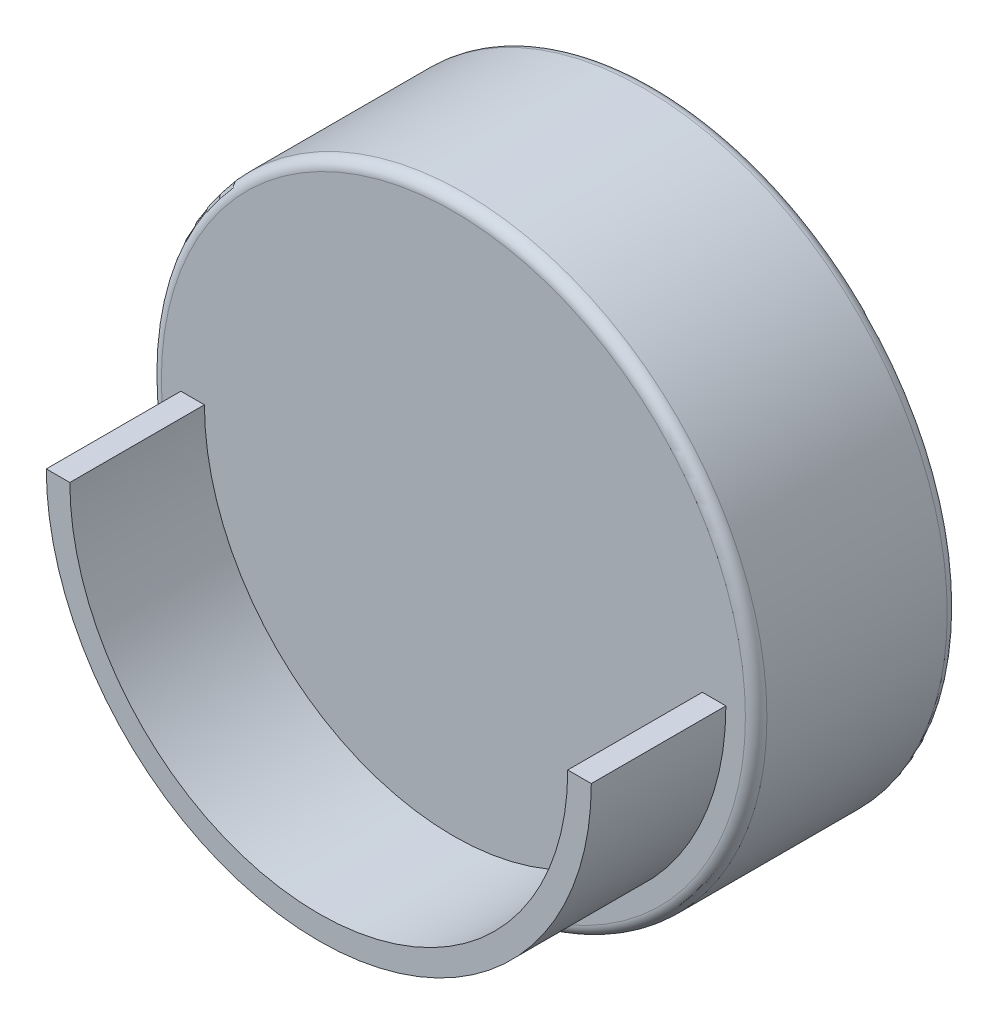
ISO-10303-21;
HEADER;
FILE_DESCRIPTION(('STEP AP214'),'2;1');
FILE_NAME('part.step','',(''),(''),'','','');
FILE_SCHEMA(('AUTOMOTIVE_DESIGN { 1 0 10303 214 1 1 1 1 }'));
ENDSEC;
DATA;
#1=APPLICATION_CONTEXT('core data for automotive mechanical design processes');
#2=APPLICATION_PROTOCOL_DEFINITION('international standard','automotive_design',2000,#1);
#3=PRODUCT_CONTEXT('',#1,'mechanical');
#4=PRODUCT('Part','Part','',(#3));
#5=PRODUCT_RELATED_PRODUCT_CATEGORY('part','',(#4));
#6=PRODUCT_DEFINITION_FORMATION('','',#4);
#7=PRODUCT_DEFINITION_CONTEXT('part definition',#1,'design');
#8=PRODUCT_DEFINITION('design','',#6,#7);
#9=PRODUCT_DEFINITION_SHAPE('','',#8);
#10=(LENGTH_UNIT() NAMED_UNIT(*) SI_UNIT(.MILLI.,.METRE.));
#11=(NAMED_UNIT(*) PLANE_ANGLE_UNIT() SI_UNIT($,.RADIAN.));
#12=(NAMED_UNIT(*) SI_UNIT($,.STERADIAN.) SOLID_ANGLE_UNIT());
#13=UNCERTAINTY_MEASURE_WITH_UNIT(LENGTH_MEASURE(1.E-05),#10,'distance_accuracy_value','');
#14=(GEOMETRIC_REPRESENTATION_CONTEXT(3) GLOBAL_UNCERTAINTY_ASSIGNED_CONTEXT((#13)) GLOBAL_UNIT_ASSIGNED_CONTEXT((#10,
#11,#12)) REPRESENTATION_CONTEXT('',''));
#15=CARTESIAN_POINT('',(0.,0.,0.));
#16=DIRECTION('',(0.,0.,1.));
#17=DIRECTION('',(1.,0.,0.));
#18=AXIS2_PLACEMENT_3D('',#15,#16,#17);
#19=CARTESIAN_POINT('',(0.,0.,15.));
#20=DIRECTION('',(0.,0.,-1.));
#21=DIRECTION('',(-1.,0.,0.));
#22=AXIS2_PLACEMENT_3D('',#19,#20,#21);
#23=CYLINDRICAL_SURFACE('',#22,22.5);
#24=CARTESIAN_POINT('',(0.,0.,0.8));
#25=DIRECTION('',(0.,0.,1.));
#26=DIRECTION('',(1.,0.,0.));
#27=AXIS2_PLACEMENT_3D('',#24,#25,#26);
#28=CIRCLE('',#27,22.5);
#29=CARTESIAN_POINT('',(22.5,0.,0.8));
#30=VERTEX_POINT('',#29);
#31=EDGE_CURVE('E112',#30,#30,#28,.T.);
#32=ORIENTED_EDGE('',*,*,#31,.T.);
#33=EDGE_LOOP('',(#32));
#34=FACE_BOUND('',#33,.T.);
#35=CARTESIAN_POINT('',(0.,0.,14.2));
#36=DIRECTION('',(0.,0.,1.));
#37=DIRECTION('',(1.,0.,0.));
#38=AXIS2_PLACEMENT_3D('',#35,#36,#37);
#39=CIRCLE('',#38,22.5);
#40=CARTESIAN_POINT('',(22.5,0.,14.2));
#41=VERTEX_POINT('',#40);
#42=EDGE_CURVE('E109',#41,#41,#39,.F.);
#43=ORIENTED_EDGE('',*,*,#42,.T.);
#44=EDGE_LOOP('',(#43));
#45=FACE_BOUND('',#44,.T.);
#46=ADVANCED_FACE('F39',(#34,#45),#23,.T.);
#47=CARTESIAN_POINT('',(0.,0.,15.));
#48=DIRECTION('',(0.,0.,1.));
#49=DIRECTION('',(1.,0.,0.));
#50=AXIS2_PLACEMENT_3D('',#47,#48,#49);
#51=PLANE('',#50);
#52=CARTESIAN_POINT('',(0.,0.,15.));
#53=DIRECTION('',(0.,0.,1.));
#54=DIRECTION('',(1.,0.,0.));
#55=AXIS2_PLACEMENT_3D('',#52,#53,#54);
#56=CIRCLE('',#55,21.7);
#57=CARTESIAN_POINT('',(21.7,0.,15.));
#58=VERTEX_POINT('',#57);
#59=EDGE_CURVE('E11',#58,#58,#56,.T.);
#60=ORIENTED_EDGE('',*,*,#59,.T.);
#61=EDGE_LOOP('',(#60));
#62=FACE_BOUND('',#61,.T.);
#63=CARTESIAN_POINT('',(0.,0.,15.));
#64=DIRECTION('',(0.,0.,1.));
#65=DIRECTION('',(1.,0.,0.));
#66=AXIS2_PLACEMENT_3D('',#63,#64,#65);
#67=CIRCLE('',#66,20.25);
#68=CARTESIAN_POINT('',(-20.25,0.,15.));
#69=VERTEX_POINT('',#68);
#70=CARTESIAN_POINT('',(20.25,0.,15.));
#71=VERTEX_POINT('',#70);
#72=EDGE_CURVE('E95',#69,#71,#67,.T.);
#73=ORIENTED_EDGE('',*,*,#72,.F.);
#74=DIRECTION('',(1.,0.,0.));
#75=VECTOR('',#74,1.);
#76=CARTESIAN_POINT('',(-22.5,0.,15.));
#77=LINE('',#76,#75);
#78=CARTESIAN_POINT('',(-18.5,0.,15.));
#79=VERTEX_POINT('',#78);
#80=EDGE_CURVE('E78',#69,#79,#77,.T.);
#81=ORIENTED_EDGE('',*,*,#80,.T.);
#82=CARTESIAN_POINT('',(0.,0.,15.));
#83=DIRECTION('',(0.,0.,1.));
#84=DIRECTION('',(1.,0.,0.));
#85=AXIS2_PLACEMENT_3D('',#82,#83,#84);
#86=CIRCLE('',#85,18.5);
#87=CARTESIAN_POINT('',(18.5,0.,15.));
#88=VERTEX_POINT('',#87);
#89=EDGE_CURVE('E103',#88,#79,#86,.F.);
#90=ORIENTED_EDGE('',*,*,#89,.F.);
#91=EDGE_CURVE('E54',#88,#71,#77,.T.);
#92=ORIENTED_EDGE('',*,*,#91,.T.);
#93=EDGE_LOOP('',(#73,#81,#90,#92));
#94=FACE_BOUND('',#93,.T.);
#95=ADVANCED_FACE('F101',(#62,#94),#51,.T.);
#96=CARTESIAN_POINT('',(0.,0.,0.));
#97=DIRECTION('',(0.,0.,1.));
#98=DIRECTION('',(1.,0.,0.));
#99=AXIS2_PLACEMENT_3D('',#96,#97,#98);
#100=PLANE('',#99);
#101=CARTESIAN_POINT('',(0.,0.,0.));
#102=DIRECTION('',(0.,0.,-1.));
#103=DIRECTION('',(-1.,0.,0.));
#104=AXIS2_PLACEMENT_3D('',#101,#102,#103);
#105=CIRCLE('',#104,20.25);
#106=CARTESIAN_POINT('',(-20.25,0.,0.));
#107=VERTEX_POINT('',#106);
#108=EDGE_CURVE('E178',#107,#107,#105,.T.);
#109=ORIENTED_EDGE('',*,*,#108,.F.);
#110=EDGE_LOOP('',(#109));
#111=FACE_BOUND('',#110,.T.);
#112=CARTESIAN_POINT('',(0.,0.,0.));
#113=DIRECTION('',(0.,0.,1.));
#114=DIRECTION('',(1.,0.,0.));
#115=AXIS2_PLACEMENT_3D('',#112,#113,#114);
#116=CIRCLE('',#115,21.7);
#117=CARTESIAN_POINT('',(21.7,0.,0.));
#118=VERTEX_POINT('',#117);
#119=EDGE_CURVE('E47',#118,#118,#116,.F.);
#120=ORIENTED_EDGE('',*,*,#119,.T.);
#121=EDGE_LOOP('',(#120));
#122=FACE_BOUND('',#121,.T.);
#123=ADVANCED_FACE('F117',(#111,#122),#100,.F.);
#124=CARTESIAN_POINT('',(0.,0.,25.));
#125=DIRECTION('',(0.,0.,1.));
#126=DIRECTION('',(1.,0.,0.));
#127=AXIS2_PLACEMENT_3D('',#124,#125,#126);
#128=PLANE('',#127);
#129=DIRECTION('',(1.,0.,0.));
#130=VECTOR('',#129,1.);
#131=CARTESIAN_POINT('',(-22.5,0.,25.));
#132=LINE('',#131,#130);
#133=CARTESIAN_POINT('',(-20.25,0.,25.));
#134=VERTEX_POINT('',#133);
#135=CARTESIAN_POINT('',(-18.5,0.,25.));
#136=VERTEX_POINT('',#135);
#137=EDGE_CURVE('E186',#134,#136,#132,.T.);
#138=ORIENTED_EDGE('',*,*,#137,.F.);
#139=CARTESIAN_POINT('',(0.,0.,25.));
#140=DIRECTION('',(0.,0.,1.));
#141=DIRECTION('',(1.,0.,0.));
#142=AXIS2_PLACEMENT_3D('',#139,#140,#141);
#143=CIRCLE('',#142,20.25);
#144=CARTESIAN_POINT('',(20.25,0.,25.));
#145=VERTEX_POINT('',#144);
#146=EDGE_CURVE('E97',#134,#145,#143,.T.);
#147=ORIENTED_EDGE('',*,*,#146,.T.);
#148=CARTESIAN_POINT('',(18.5,0.,25.));
#149=VERTEX_POINT('',#148);
#150=EDGE_CURVE('E59',#149,#145,#132,.T.);
#151=ORIENTED_EDGE('',*,*,#150,.F.);
#152=CARTESIAN_POINT('',(0.,0.,25.));
#153=DIRECTION('',(0.,0.,1.));
#154=DIRECTION('',(1.,0.,0.));
#155=AXIS2_PLACEMENT_3D('',#152,#153,#154);
#156=CIRCLE('',#155,18.5);
#157=EDGE_CURVE('E98',#136,#149,#156,.T.);
#158=ORIENTED_EDGE('',*,*,#157,.F.);
#159=EDGE_LOOP('',(#138,#147,#151,#158));
#160=FACE_BOUND('',#159,.T.);
#161=ADVANCED_FACE('F140',(#160),#128,.T.);
#162=CARTESIAN_POINT('',(0.,0.,25.));
#163=DIRECTION('',(0.,0.,-1.));
#164=DIRECTION('',(-1.,0.,0.));
#165=AXIS2_PLACEMENT_3D('',#162,#163,#164);
#166=CYLINDRICAL_SURFACE('',#165,20.25);
#167=ORIENTED_EDGE('',*,*,#146,.F.);
#168=DIRECTION('',(0.,0.,-1.));
#169=VECTOR('',#168,1.);
#170=CARTESIAN_POINT('',(-20.25,0.,25.));
#171=LINE('',#170,#169);
#172=EDGE_CURVE('E81',#134,#69,#171,.T.);
#173=ORIENTED_EDGE('',*,*,#172,.T.);
#174=ORIENTED_EDGE('',*,*,#72,.T.);
#175=DIRECTION('',(0.,0.,-1.));
#176=VECTOR('',#175,1.);
#177=CARTESIAN_POINT('',(20.25,0.,25.));
#178=LINE('',#177,#176);
#179=EDGE_CURVE('E99',#71,#145,#178,.F.);
#180=ORIENTED_EDGE('',*,*,#179,.T.);
#181=EDGE_LOOP('',(#167,#173,#174,#180));
#182=FACE_BOUND('',#181,.T.);
#183=ADVANCED_FACE('F94',(#182),#166,.T.);
#184=CARTESIAN_POINT('',(0.,0.,25.));
#185=DIRECTION('',(0.,0.,-1.));
#186=DIRECTION('',(-1.,0.,0.));
#187=AXIS2_PLACEMENT_3D('',#184,#185,#186);
#188=CYLINDRICAL_SURFACE('',#187,18.5);
#189=DIRECTION('',(0.,0.,-1.));
#190=VECTOR('',#189,1.);
#191=CARTESIAN_POINT('',(-18.5,0.,25.));
#192=LINE('',#191,#190);
#193=EDGE_CURVE('E84',#136,#79,#192,.T.);
#194=ORIENTED_EDGE('',*,*,#193,.F.);
#195=ORIENTED_EDGE('',*,*,#157,.T.);
#196=DIRECTION('',(0.,0.,-1.));
#197=VECTOR('',#196,1.);
#198=CARTESIAN_POINT('',(18.5,0.,25.));
#199=LINE('',#198,#197);
#200=EDGE_CURVE('E89',#88,#149,#199,.F.);
#201=ORIENTED_EDGE('',*,*,#200,.F.);
#202=ORIENTED_EDGE('',*,*,#89,.T.);
#203=EDGE_LOOP('',(#194,#195,#201,#202));
#204=FACE_BOUND('',#203,.T.);
#205=ADVANCED_FACE('F147',(#204),#188,.F.);
#206=CARTESIAN_POINT('',(-22.5,0.,25.));
#207=DIRECTION('',(0.,-1.,0.));
#208=DIRECTION('',(0.,0.,-1.));
#209=AXIS2_PLACEMENT_3D('',#206,#207,#208);
#210=PLANE('',#209);
#211=ORIENTED_EDGE('',*,*,#137,.T.);
#212=ORIENTED_EDGE('',*,*,#193,.T.);
#213=ORIENTED_EDGE('',*,*,#80,.F.);
#214=ORIENTED_EDGE('',*,*,#172,.F.);
#215=EDGE_LOOP('',(#211,#212,#213,#214));
#216=FACE_BOUND('',#215,.T.);
#217=ADVANCED_FACE('F80',(#216),#210,.F.);
#218=ORIENTED_EDGE('',*,*,#91,.F.);
#219=ORIENTED_EDGE('',*,*,#200,.T.);
#220=ORIENTED_EDGE('',*,*,#150,.T.);
#221=ORIENTED_EDGE('',*,*,#179,.F.);
#222=EDGE_LOOP('',(#218,#219,#220,#221));
#223=FACE_BOUND('',#222,.T.);
#224=ADVANCED_FACE('F122',(#223),#210,.F.);
#225=CARTESIAN_POINT('',(0.,0.,0.8));
#226=DIRECTION('',(0.,0.,1.));
#227=DIRECTION('',(1.,0.,0.));
#228=AXIS2_PLACEMENT_3D('',#225,#226,#227);
#229=TOROIDAL_SURFACE('',#228,21.7,0.8);
#230=ORIENTED_EDGE('',*,*,#119,.F.);
#231=EDGE_LOOP('',(#230));
#232=FACE_BOUND('',#231,.T.);
#233=ORIENTED_EDGE('',*,*,#31,.F.);
#234=EDGE_LOOP('',(#233));
#235=FACE_BOUND('',#234,.T.);
#236=ADVANCED_FACE('F119',(#232,#235),#229,.T.);
#237=CARTESIAN_POINT('',(0.,0.,14.2));
#238=DIRECTION('',(0.,0.,1.));
#239=DIRECTION('',(1.,0.,0.));
#240=AXIS2_PLACEMENT_3D('',#237,#238,#239);
#241=TOROIDAL_SURFACE('',#240,21.7,0.8);
#242=ORIENTED_EDGE('',*,*,#42,.F.);
#243=EDGE_LOOP('',(#242));
#244=FACE_BOUND('',#243,.T.);
#245=ORIENTED_EDGE('',*,*,#59,.F.);
#246=EDGE_LOOP('',(#245));
#247=FACE_BOUND('',#246,.T.);
#248=ADVANCED_FACE('F41',(#244,#247),#241,.T.);
#249=CARTESIAN_POINT('',(0.,0.,10.));
#250=DIRECTION('',(0.,0.,-1.));
#251=DIRECTION('',(-1.,0.,0.));
#252=AXIS2_PLACEMENT_3D('',#249,#250,#251);
#253=CYLINDRICAL_SURFACE('',#252,20.25);
#254=CARTESIAN_POINT('',(0.,0.,10.));
#255=DIRECTION('',(0.,0.,-1.));
#256=DIRECTION('',(-1.,0.,0.));
#257=AXIS2_PLACEMENT_3D('',#254,#255,#256);
#258=CIRCLE('',#257,20.25);
#259=CARTESIAN_POINT('',(-20.25,0.,10.));
#260=VERTEX_POINT('',#259);
#261=EDGE_CURVE('E181',#260,#260,#258,.T.);
#262=ORIENTED_EDGE('',*,*,#261,.F.);
#263=EDGE_LOOP('',(#262));
#264=FACE_BOUND('',#263,.T.);
#265=ORIENTED_EDGE('',*,*,#108,.T.);
#266=EDGE_LOOP('',(#265));
#267=FACE_BOUND('',#266,.T.);
#268=ADVANCED_FACE('F132',(#264,#267),#253,.F.);
#269=CARTESIAN_POINT('',(0.,0.,10.));
#270=DIRECTION('',(0.,0.,-1.));
#271=DIRECTION('',(-1.,0.,0.));
#272=AXIS2_PLACEMENT_3D('',#269,#270,#271);
#273=PLANE('',#272);
#274=CARTESIAN_POINT('',(0.,0.,10.));
#275=DIRECTION('',(0.,0.,-1.));
#276=DIRECTION('',(-1.,0.,0.));
#277=AXIS2_PLACEMENT_3D('',#274,#275,#276);
#278=CIRCLE('',#277,12.5);
#279=CARTESIAN_POINT('',(-12.5,0.,10.));
#280=VERTEX_POINT('',#279);
#281=EDGE_CURVE('E173',#280,#280,#278,.T.);
#282=ORIENTED_EDGE('',*,*,#281,.F.);
#283=EDGE_LOOP('',(#282));
#284=FACE_BOUND('',#283,.T.);
#285=ORIENTED_EDGE('',*,*,#261,.T.);
#286=EDGE_LOOP('',(#285));
#287=FACE_BOUND('',#286,.T.);
#288=ADVANCED_FACE('F158',(#284,#287),#273,.T.);
#289=CARTESIAN_POINT('',(0.,0.,10.));
#290=DIRECTION('',(0.,0.,-1.));
#291=DIRECTION('',(-1.,0.,0.));
#292=AXIS2_PLACEMENT_3D('',#289,#290,#291);
#293=CYLINDRICAL_SURFACE('',#292,12.5);
#294=ORIENTED_EDGE('',*,*,#281,.T.);
#295=EDGE_LOOP('',(#294));
#296=FACE_BOUND('',#295,.T.);
#297=CARTESIAN_POINT('',(0.,0.,0.));
#298=DIRECTION('',(0.,0.,-1.));
#299=DIRECTION('',(-1.,0.,0.));
#300=AXIS2_PLACEMENT_3D('',#297,#298,#299);
#301=CIRCLE('',#300,12.5);
#302=CARTESIAN_POINT('',(-12.5,0.,0.));
#303=VERTEX_POINT('',#302);
#304=EDGE_CURVE('E176',#303,#303,#301,.T.);
#305=ORIENTED_EDGE('',*,*,#304,.F.);
#306=EDGE_LOOP('',(#305));
#307=FACE_BOUND('',#306,.T.);
#308=ADVANCED_FACE('F162',(#296,#307),#293,.T.);
#309=ORIENTED_EDGE('',*,*,#304,.T.);
#310=EDGE_LOOP('',(#309));
#311=FACE_BOUND('',#310,.T.);
#312=ADVANCED_FACE('F143',(#311),#100,.F.);
#313=CLOSED_SHELL('',(#46,#95,#123,#161,#183,#205,#217,#224,#236,#248,#268,#288,#308,#312));
#314=MANIFOLD_SOLID_BREP('B2',#313);
#315=ADVANCED_BREP_SHAPE_REPRESENTATION('',(#18,#314),#14);
#316=SHAPE_DEFINITION_REPRESENTATION(#9,#315);
ENDSEC;
END-ISO-10303-21;
